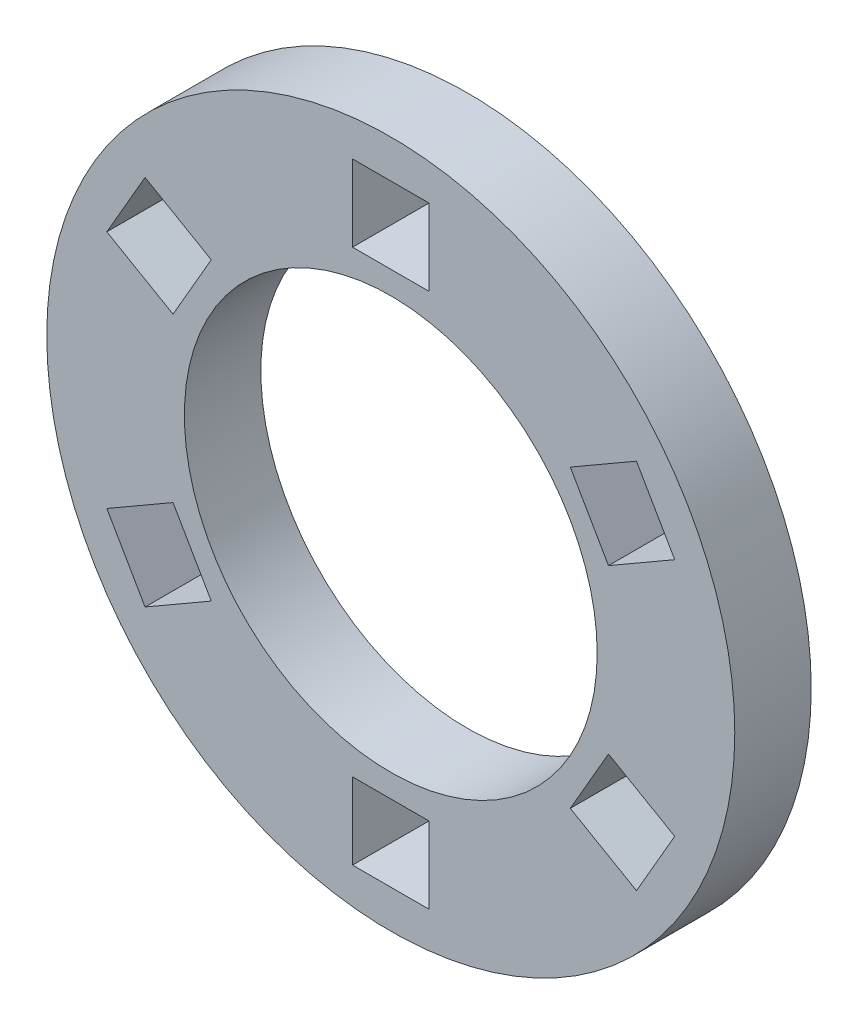
ISO-10303-21;
HEADER;
FILE_DESCRIPTION(('STEP AP214'),'2;1');
FILE_NAME('part.step','',(''),(''),'','','');
FILE_SCHEMA(('AUTOMOTIVE_DESIGN { 1 0 10303 214 1 1 1 1 }'));
ENDSEC;
DATA;
#1=APPLICATION_CONTEXT('core data for automotive mechanical design processes');
#2=APPLICATION_PROTOCOL_DEFINITION('international standard','automotive_design',2000,#1);
#3=PRODUCT_CONTEXT('',#1,'mechanical');
#4=PRODUCT('Part','Part','',(#3));
#5=PRODUCT_RELATED_PRODUCT_CATEGORY('part','',(#4));
#6=PRODUCT_DEFINITION_FORMATION('','',#4);
#7=PRODUCT_DEFINITION_CONTEXT('part definition',#1,'design');
#8=PRODUCT_DEFINITION('design','',#6,#7);
#9=PRODUCT_DEFINITION_SHAPE('','',#8);
#10=(LENGTH_UNIT() NAMED_UNIT(*) SI_UNIT(.MILLI.,.METRE.));
#11=(NAMED_UNIT(*) PLANE_ANGLE_UNIT() SI_UNIT($,.RADIAN.));
#12=(NAMED_UNIT(*) SI_UNIT($,.STERADIAN.) SOLID_ANGLE_UNIT());
#13=UNCERTAINTY_MEASURE_WITH_UNIT(LENGTH_MEASURE(1.E-05),#10,'distance_accuracy_value','');
#14=(GEOMETRIC_REPRESENTATION_CONTEXT(3) GLOBAL_UNCERTAINTY_ASSIGNED_CONTEXT((#13)) GLOBAL_UNIT_ASSIGNED_CONTEXT((#10,
#11,#12)) REPRESENTATION_CONTEXT('',''));
#15=CARTESIAN_POINT('',(0.,0.,0.));
#16=DIRECTION('',(0.,0.,1.));
#17=DIRECTION('',(1.,0.,0.));
#18=AXIS2_PLACEMENT_3D('',#15,#16,#17);
#19=CARTESIAN_POINT('',(0.,0.,5.));
#20=DIRECTION('',(0.,0.,1.));
#21=DIRECTION('',(1.,0.,0.));
#22=AXIS2_PLACEMENT_3D('',#19,#20,#21);
#23=PLANE('',#22);
#24=CARTESIAN_POINT('',(0.,0.,5.));
#25=DIRECTION('',(0.,0.,1.));
#26=DIRECTION('',(1.,0.,0.));
#27=AXIS2_PLACEMENT_3D('',#24,#25,#26);
#28=CIRCLE('',#27,22.5);
#29=CARTESIAN_POINT('',(22.5,0.,5.));
#30=VERTEX_POINT('',#29);
#31=EDGE_CURVE('E11',#30,#30,#28,.T.);
#32=ORIENTED_EDGE('',*,*,#31,.T.);
#33=EDGE_LOOP('',(#32));
#34=FACE_BOUND('',#33,.T.);
#35=CARTESIAN_POINT('',(0.,0.,5.));
#36=DIRECTION('',(0.,0.,1.));
#37=DIRECTION('',(1.,0.,0.));
#38=AXIS2_PLACEMENT_3D('',#35,#36,#37);
#39=CIRCLE('',#38,13.5);
#40=CARTESIAN_POINT('',(13.5,0.,5.));
#41=VERTEX_POINT('',#40);
#42=EDGE_CURVE('E385',#41,#41,#39,.T.);
#43=ORIENTED_EDGE('',*,*,#42,.F.);
#44=EDGE_LOOP('',(#43));
#45=FACE_BOUND('',#44,.T.);
#46=DIRECTION('',(1.,0.,0.));
#47=VECTOR('',#46,1.);
#48=CARTESIAN_POINT('',(-2.5,15.,5.));
#49=LINE('',#48,#47);
#50=CARTESIAN_POINT('',(-2.5,15.,5.));
#51=VERTEX_POINT('',#50);
#52=CARTESIAN_POINT('',(2.5,15.,5.));
#53=VERTEX_POINT('',#52);
#54=EDGE_CURVE('E356',#51,#53,#49,.T.);
#55=ORIENTED_EDGE('',*,*,#54,.F.);
#56=DIRECTION('',(0.,-1.,0.));
#57=VECTOR('',#56,1.);
#58=CARTESIAN_POINT('',(-2.5,20.,5.));
#59=LINE('',#58,#57);
#60=CARTESIAN_POINT('',(-2.5,20.,5.));
#61=VERTEX_POINT('',#60);
#62=EDGE_CURVE('E354',#61,#51,#59,.T.);
#63=ORIENTED_EDGE('',*,*,#62,.F.);
#64=DIRECTION('',(-1.,0.,0.));
#65=VECTOR('',#64,1.);
#66=CARTESIAN_POINT('',(-2.5,20.,5.));
#67=LINE('',#66,#65);
#68=CARTESIAN_POINT('',(2.5,20.,5.));
#69=VERTEX_POINT('',#68);
#70=EDGE_CURVE('E362',#69,#61,#67,.T.);
#71=ORIENTED_EDGE('',*,*,#70,.F.);
#72=DIRECTION('',(0.,1.,0.));
#73=VECTOR('',#72,1.);
#74=CARTESIAN_POINT('',(2.5,20.,5.));
#75=LINE('',#74,#73);
#76=EDGE_CURVE('E359',#53,#69,#75,.T.);
#77=ORIENTED_EDGE('',*,*,#76,.F.);
#78=EDGE_LOOP('',(#55,#63,#71,#77));
#79=FACE_BOUND('',#78,.T.);
#80=DIRECTION('',(-0.866025403784439,-0.5,0.));
#81=VECTOR('',#80,1.);
#82=CARTESIAN_POINT('',(16.0705080756888,12.1650635094611,5.));
#83=LINE('',#82,#81);
#84=CARTESIAN_POINT('',(16.0705080756888,12.1650635094611,5.));
#85=VERTEX_POINT('',#84);
#86=CARTESIAN_POINT('',(11.7403810567666,9.6650635094611,5.));
#87=VERTEX_POINT('',#86);
#88=EDGE_CURVE('E325',#85,#87,#83,.T.);
#89=ORIENTED_EDGE('',*,*,#88,.F.);
#90=DIRECTION('',(-0.5,0.866025403784439,0.));
#91=VECTOR('',#90,1.);
#92=CARTESIAN_POINT('',(16.0705080756888,12.1650635094611,5.));
#93=LINE('',#92,#91);
#94=CARTESIAN_POINT('',(18.5705080756888,7.83493649053891,5.));
#95=VERTEX_POINT('',#94);
#96=EDGE_CURVE('E323',#95,#85,#93,.T.);
#97=ORIENTED_EDGE('',*,*,#96,.F.);
#98=DIRECTION('',(0.866025403784438,0.500000000000001,0.));
#99=VECTOR('',#98,1.);
#100=CARTESIAN_POINT('',(18.5705080756888,7.83493649053891,5.));
#101=LINE('',#100,#99);
#102=CARTESIAN_POINT('',(14.2403810567666,5.3349364905389,5.));
#103=VERTEX_POINT('',#102);
#104=EDGE_CURVE('E331',#103,#95,#101,.T.);
#105=ORIENTED_EDGE('',*,*,#104,.F.);
#106=DIRECTION('',(0.5,-0.866025403784438,0.));
#107=VECTOR('',#106,1.);
#108=CARTESIAN_POINT('',(11.7403810567666,9.6650635094611,5.));
#109=LINE('',#108,#107);
#110=EDGE_CURVE('E328',#87,#103,#109,.T.);
#111=ORIENTED_EDGE('',*,*,#110,.F.);
#112=EDGE_LOOP('',(#89,#97,#105,#111));
#113=FACE_BOUND('',#112,.T.);
#114=DIRECTION('',(-0.866025403784439,0.5,0.));
#115=VECTOR('',#114,1.);
#116=CARTESIAN_POINT('',(18.5705080756888,-7.8349364905389,5.));
#117=LINE('',#116,#115);
#118=CARTESIAN_POINT('',(18.5705080756888,-7.8349364905389,5.));
#119=VERTEX_POINT('',#118);
#120=CARTESIAN_POINT('',(14.2403810567666,-5.3349364905389,5.));
#121=VERTEX_POINT('',#120);
#122=EDGE_CURVE('E294',#119,#121,#117,.T.);
#123=ORIENTED_EDGE('',*,*,#122,.F.);
#124=DIRECTION('',(0.5,0.866025403784439,0.));
#125=VECTOR('',#124,1.);
#126=CARTESIAN_POINT('',(18.5705080756888,-7.8349364905389,5.));
#127=LINE('',#126,#125);
#128=CARTESIAN_POINT('',(16.0705080756888,-12.1650635094611,5.));
#129=VERTEX_POINT('',#128);
#130=EDGE_CURVE('E292',#129,#119,#127,.T.);
#131=ORIENTED_EDGE('',*,*,#130,.F.);
#132=DIRECTION('',(0.866025403784439,-0.499999999999999,0.));
#133=VECTOR('',#132,1.);
#134=CARTESIAN_POINT('',(16.0705080756888,-12.1650635094611,5.));
#135=LINE('',#134,#133);
#136=CARTESIAN_POINT('',(11.7403810567666,-9.6650635094611,5.));
#137=VERTEX_POINT('',#136);
#138=EDGE_CURVE('E300',#137,#129,#135,.T.);
#139=ORIENTED_EDGE('',*,*,#138,.F.);
#140=DIRECTION('',(-0.499999999999999,-0.866025403784439,0.));
#141=VECTOR('',#140,1.);
#142=CARTESIAN_POINT('',(14.2403810567666,-5.3349364905389,5.));
#143=LINE('',#142,#141);
#144=EDGE_CURVE('E297',#121,#137,#143,.T.);
#145=ORIENTED_EDGE('',*,*,#144,.F.);
#146=EDGE_LOOP('',(#123,#131,#139,#145));
#147=FACE_BOUND('',#146,.T.);
#148=DIRECTION('',(0.,1.,0.));
#149=VECTOR('',#148,1.);
#150=CARTESIAN_POINT('',(2.5,-20.,5.));
#151=LINE('',#150,#149);
#152=CARTESIAN_POINT('',(2.5,-20.,5.));
#153=VERTEX_POINT('',#152);
#154=CARTESIAN_POINT('',(2.5,-15.,5.));
#155=VERTEX_POINT('',#154);
#156=EDGE_CURVE('E263',#153,#155,#151,.T.);
#157=ORIENTED_EDGE('',*,*,#156,.F.);
#158=DIRECTION('',(1.,0.,0.));
#159=VECTOR('',#158,1.);
#160=CARTESIAN_POINT('',(2.5,-20.,5.));
#161=LINE('',#160,#159);
#162=CARTESIAN_POINT('',(-2.5,-20.,5.));
#163=VERTEX_POINT('',#162);
#164=EDGE_CURVE('E261',#163,#153,#161,.T.);
#165=ORIENTED_EDGE('',*,*,#164,.F.);
#166=DIRECTION('',(0.,-1.,0.));
#167=VECTOR('',#166,1.);
#168=CARTESIAN_POINT('',(-2.5,-20.,5.));
#169=LINE('',#168,#167);
#170=CARTESIAN_POINT('',(-2.5,-15.,5.));
#171=VERTEX_POINT('',#170);
#172=EDGE_CURVE('E269',#171,#163,#169,.T.);
#173=ORIENTED_EDGE('',*,*,#172,.F.);
#174=DIRECTION('',(-1.,0.,0.));
#175=VECTOR('',#174,1.);
#176=CARTESIAN_POINT('',(2.5,-15.,5.));
#177=LINE('',#176,#175);
#178=EDGE_CURVE('E266',#155,#171,#177,.T.);
#179=ORIENTED_EDGE('',*,*,#178,.F.);
#180=EDGE_LOOP('',(#157,#165,#173,#179));
#181=FACE_BOUND('',#180,.T.);
#182=DIRECTION('',(0.866025403784439,0.5,0.));
#183=VECTOR('',#182,1.);
#184=CARTESIAN_POINT('',(-16.0705080756888,-12.1650635094611,5.));
#185=LINE('',#184,#183);
#186=CARTESIAN_POINT('',(-16.0705080756888,-12.1650635094611,5.));
#187=VERTEX_POINT('',#186);
#188=CARTESIAN_POINT('',(-11.7403810567666,-9.6650635094611,5.));
#189=VERTEX_POINT('',#188);
#190=EDGE_CURVE('E232',#187,#189,#185,.T.);
#191=ORIENTED_EDGE('',*,*,#190,.F.);
#192=DIRECTION('',(0.5,-0.866025403784438,0.));
#193=VECTOR('',#192,1.);
#194=CARTESIAN_POINT('',(-16.0705080756888,-12.1650635094611,5.));
#195=LINE('',#194,#193);
#196=CARTESIAN_POINT('',(-18.5705080756888,-7.83493649053891,5.));
#197=VERTEX_POINT('',#196);
#198=EDGE_CURVE('E230',#197,#187,#195,.T.);
#199=ORIENTED_EDGE('',*,*,#198,.F.);
#200=DIRECTION('',(-0.866025403784438,-0.500000000000001,0.));
#201=VECTOR('',#200,1.);
#202=CARTESIAN_POINT('',(-18.5705080756888,-7.83493649053891,5.));
#203=LINE('',#202,#201);
#204=CARTESIAN_POINT('',(-14.2403810567666,-5.33493649053891,5.));
#205=VERTEX_POINT('',#204);
#206=EDGE_CURVE('E238',#205,#197,#203,.T.);
#207=ORIENTED_EDGE('',*,*,#206,.F.);
#208=DIRECTION('',(-0.5,0.866025403784438,0.));
#209=VECTOR('',#208,1.);
#210=CARTESIAN_POINT('',(-11.7403810567666,-9.6650635094611,5.));
#211=LINE('',#210,#209);
#212=EDGE_CURVE('E235',#189,#205,#211,.T.);
#213=ORIENTED_EDGE('',*,*,#212,.F.);
#214=EDGE_LOOP('',(#191,#199,#207,#213));
#215=FACE_BOUND('',#214,.T.);
#216=DIRECTION('',(0.866025403784439,-0.5,0.));
#217=VECTOR('',#216,1.);
#218=CARTESIAN_POINT('',(-18.5705080756888,7.83493649053889,5.));
#219=LINE('',#218,#217);
#220=CARTESIAN_POINT('',(-18.5705080756888,7.83493649053889,5.));
#221=VERTEX_POINT('',#220);
#222=CARTESIAN_POINT('',(-14.2403810567666,5.33493649053889,5.));
#223=VERTEX_POINT('',#222);
#224=EDGE_CURVE('E202',#221,#223,#219,.T.);
#225=ORIENTED_EDGE('',*,*,#224,.F.);
#226=DIRECTION('',(-0.5,-0.866025403784439,0.));
#227=VECTOR('',#226,1.);
#228=CARTESIAN_POINT('',(-18.5705080756888,7.83493649053889,5.));
#229=LINE('',#228,#227);
#230=CARTESIAN_POINT('',(-16.0705080756888,12.1650635094611,5.));
#231=VERTEX_POINT('',#230);
#232=EDGE_CURVE('E194',#231,#221,#229,.T.);
#233=ORIENTED_EDGE('',*,*,#232,.F.);
#234=DIRECTION('',(-0.866025403784439,0.499999999999999,0.));
#235=VECTOR('',#234,1.);
#236=CARTESIAN_POINT('',(-16.0705080756888,12.1650635094611,5.));
#237=LINE('',#236,#235);
#238=CARTESIAN_POINT('',(-11.7403810567666,9.66506350946109,5.));
#239=VERTEX_POINT('',#238);
#240=EDGE_CURVE('E216',#239,#231,#237,.T.);
#241=ORIENTED_EDGE('',*,*,#240,.F.);
#242=DIRECTION('',(0.499999999999999,0.866025403784439,0.));
#243=VECTOR('',#242,1.);
#244=CARTESIAN_POINT('',(-14.2403810567666,5.33493649053889,5.));
#245=LINE('',#244,#243);
#246=EDGE_CURVE('E214',#223,#239,#245,.T.);
#247=ORIENTED_EDGE('',*,*,#246,.F.);
#248=EDGE_LOOP('',(#225,#233,#241,#247));
#249=FACE_BOUND('',#248,.T.);
#250=ADVANCED_FACE('F33',(#34,#45,#79,#113,#147,#181,#215,#249),#23,.T.);
#251=CARTESIAN_POINT('',(0.,0.,0.));
#252=DIRECTION('',(0.,0.,1.));
#253=DIRECTION('',(1.,0.,0.));
#254=AXIS2_PLACEMENT_3D('',#251,#252,#253);
#255=PLANE('',#254);
#256=DIRECTION('',(0.5,-0.866025403784438,0.));
#257=VECTOR('',#256,1.);
#258=CARTESIAN_POINT('',(-16.0705080756888,-12.1650635094611,0.));
#259=LINE('',#258,#257);
#260=CARTESIAN_POINT('',(-18.5705080756888,-7.83493649053891,0.));
#261=VERTEX_POINT('',#260);
#262=CARTESIAN_POINT('',(-16.0705080756888,-12.1650635094611,0.));
#263=VERTEX_POINT('',#262);
#264=EDGE_CURVE('E210',#261,#263,#259,.T.);
#265=ORIENTED_EDGE('',*,*,#264,.T.);
#266=DIRECTION('',(0.866025403784439,0.5,0.));
#267=VECTOR('',#266,1.);
#268=CARTESIAN_POINT('',(-16.0705080756888,-12.1650635094611,0.));
#269=LINE('',#268,#267);
#270=CARTESIAN_POINT('',(-11.7403810567666,-9.6650635094611,0.));
#271=VERTEX_POINT('',#270);
#272=EDGE_CURVE('E243',#263,#271,#269,.T.);
#273=ORIENTED_EDGE('',*,*,#272,.T.);
#274=DIRECTION('',(-0.5,0.866025403784438,0.));
#275=VECTOR('',#274,1.);
#276=CARTESIAN_POINT('',(-11.7403810567666,-9.6650635094611,0.));
#277=LINE('',#276,#275);
#278=CARTESIAN_POINT('',(-14.2403810567666,-5.33493649053891,0.));
#279=VERTEX_POINT('',#278);
#280=EDGE_CURVE('E246',#271,#279,#277,.T.);
#281=ORIENTED_EDGE('',*,*,#280,.T.);
#282=DIRECTION('',(-0.866025403784438,-0.500000000000001,0.));
#283=VECTOR('',#282,1.);
#284=CARTESIAN_POINT('',(-18.5705080756888,-7.83493649053891,0.));
#285=LINE('',#284,#283);
#286=EDGE_CURVE('E233',#279,#261,#285,.T.);
#287=ORIENTED_EDGE('',*,*,#286,.T.);
#288=EDGE_LOOP('',(#265,#273,#281,#287));
#289=FACE_BOUND('',#288,.T.);
#290=DIRECTION('',(0.5,0.866025403784439,0.));
#291=VECTOR('',#290,1.);
#292=CARTESIAN_POINT('',(18.5705080756888,-7.8349364905389,0.));
#293=LINE('',#292,#291);
#294=CARTESIAN_POINT('',(16.0705080756888,-12.1650635094611,0.));
#295=VERTEX_POINT('',#294);
#296=CARTESIAN_POINT('',(18.5705080756888,-7.8349364905389,0.));
#297=VERTEX_POINT('',#296);
#298=EDGE_CURVE('E291',#295,#297,#293,.T.);
#299=ORIENTED_EDGE('',*,*,#298,.T.);
#300=DIRECTION('',(-0.866025403784439,0.5,0.));
#301=VECTOR('',#300,1.);
#302=CARTESIAN_POINT('',(18.5705080756888,-7.8349364905389,0.));
#303=LINE('',#302,#301);
#304=CARTESIAN_POINT('',(14.2403810567666,-5.3349364905389,0.));
#305=VERTEX_POINT('',#304);
#306=EDGE_CURVE('E305',#297,#305,#303,.T.);
#307=ORIENTED_EDGE('',*,*,#306,.T.);
#308=DIRECTION('',(-0.499999999999999,-0.866025403784439,0.));
#309=VECTOR('',#308,1.);
#310=CARTESIAN_POINT('',(14.2403810567666,-5.3349364905389,0.));
#311=LINE('',#310,#309);
#312=CARTESIAN_POINT('',(11.7403810567666,-9.6650635094611,0.));
#313=VERTEX_POINT('',#312);
#314=EDGE_CURVE('E308',#305,#313,#311,.T.);
#315=ORIENTED_EDGE('',*,*,#314,.T.);
#316=DIRECTION('',(0.866025403784439,-0.499999999999999,0.));
#317=VECTOR('',#316,1.);
#318=CARTESIAN_POINT('',(16.0705080756888,-12.1650635094611,0.));
#319=LINE('',#318,#317);
#320=EDGE_CURVE('E295',#313,#295,#319,.T.);
#321=ORIENTED_EDGE('',*,*,#320,.T.);
#322=EDGE_LOOP('',(#299,#307,#315,#321));
#323=FACE_BOUND('',#322,.T.);
#324=DIRECTION('',(0.,-1.,0.));
#325=VECTOR('',#324,1.);
#326=CARTESIAN_POINT('',(-2.5,20.,0.));
#327=LINE('',#326,#325);
#328=CARTESIAN_POINT('',(-2.5,20.,0.));
#329=VERTEX_POINT('',#328);
#330=CARTESIAN_POINT('',(-2.5,15.,0.));
#331=VERTEX_POINT('',#330);
#332=EDGE_CURVE('E353',#329,#331,#327,.T.);
#333=ORIENTED_EDGE('',*,*,#332,.T.);
#334=DIRECTION('',(1.,0.,0.));
#335=VECTOR('',#334,1.);
#336=CARTESIAN_POINT('',(-2.5,15.,0.));
#337=LINE('',#336,#335);
#338=CARTESIAN_POINT('',(2.5,15.,0.));
#339=VERTEX_POINT('',#338);
#340=EDGE_CURVE('E367',#331,#339,#337,.T.);
#341=ORIENTED_EDGE('',*,*,#340,.T.);
#342=DIRECTION('',(0.,1.,0.));
#343=VECTOR('',#342,1.);
#344=CARTESIAN_POINT('',(2.5,20.,0.));
#345=LINE('',#344,#343);
#346=CARTESIAN_POINT('',(2.5,20.,0.));
#347=VERTEX_POINT('',#346);
#348=EDGE_CURVE('E370',#339,#347,#345,.T.);
#349=ORIENTED_EDGE('',*,*,#348,.T.);
#350=DIRECTION('',(-1.,0.,0.));
#351=VECTOR('',#350,1.);
#352=CARTESIAN_POINT('',(-2.5,20.,0.));
#353=LINE('',#352,#351);
#354=EDGE_CURVE('E357',#347,#329,#353,.T.);
#355=ORIENTED_EDGE('',*,*,#354,.T.);
#356=EDGE_LOOP('',(#333,#341,#349,#355));
#357=FACE_BOUND('',#356,.T.);
#358=CARTESIAN_POINT('',(0.,0.,0.));
#359=DIRECTION('',(0.,0.,1.));
#360=DIRECTION('',(1.,0.,0.));
#361=AXIS2_PLACEMENT_3D('',#358,#359,#360);
#362=CIRCLE('',#361,22.5);
#363=CARTESIAN_POINT('',(22.5,0.,0.));
#364=VERTEX_POINT('',#363);
#365=EDGE_CURVE('E37',#364,#364,#362,.T.);
#366=ORIENTED_EDGE('',*,*,#365,.F.);
#367=EDGE_LOOP('',(#366));
#368=FACE_BOUND('',#367,.T.);
#369=CARTESIAN_POINT('',(0.,0.,0.));
#370=DIRECTION('',(0.,0.,1.));
#371=DIRECTION('',(1.,0.,0.));
#372=AXIS2_PLACEMENT_3D('',#369,#370,#371);
#373=CIRCLE('',#372,13.5);
#374=CARTESIAN_POINT('',(13.5,0.,0.));
#375=VERTEX_POINT('',#374);
#376=EDGE_CURVE('E384',#375,#375,#373,.T.);
#377=ORIENTED_EDGE('',*,*,#376,.T.);
#378=EDGE_LOOP('',(#377));
#379=FACE_BOUND('',#378,.T.);
#380=DIRECTION('',(-0.5,0.866025403784439,0.));
#381=VECTOR('',#380,1.);
#382=CARTESIAN_POINT('',(16.0705080756888,12.1650635094611,0.));
#383=LINE('',#382,#381);
#384=CARTESIAN_POINT('',(18.5705080756888,7.83493649053891,0.));
#385=VERTEX_POINT('',#384);
#386=CARTESIAN_POINT('',(16.0705080756888,12.1650635094611,0.));
#387=VERTEX_POINT('',#386);
#388=EDGE_CURVE('E322',#385,#387,#383,.T.);
#389=ORIENTED_EDGE('',*,*,#388,.T.);
#390=DIRECTION('',(-0.866025403784439,-0.5,0.));
#391=VECTOR('',#390,1.);
#392=CARTESIAN_POINT('',(16.0705080756888,12.1650635094611,0.));
#393=LINE('',#392,#391);
#394=CARTESIAN_POINT('',(11.7403810567666,9.6650635094611,0.));
#395=VERTEX_POINT('',#394);
#396=EDGE_CURVE('E336',#387,#395,#393,.T.);
#397=ORIENTED_EDGE('',*,*,#396,.T.);
#398=DIRECTION('',(0.5,-0.866025403784438,0.));
#399=VECTOR('',#398,1.);
#400=CARTESIAN_POINT('',(11.7403810567666,9.6650635094611,0.));
#401=LINE('',#400,#399);
#402=CARTESIAN_POINT('',(14.2403810567666,5.3349364905389,0.));
#403=VERTEX_POINT('',#402);
#404=EDGE_CURVE('E339',#395,#403,#401,.T.);
#405=ORIENTED_EDGE('',*,*,#404,.T.);
#406=DIRECTION('',(0.866025403784438,0.500000000000001,0.));
#407=VECTOR('',#406,1.);
#408=CARTESIAN_POINT('',(18.5705080756888,7.83493649053891,0.));
#409=LINE('',#408,#407);
#410=EDGE_CURVE('E326',#403,#385,#409,.T.);
#411=ORIENTED_EDGE('',*,*,#410,.T.);
#412=EDGE_LOOP('',(#389,#397,#405,#411));
#413=FACE_BOUND('',#412,.T.);
#414=DIRECTION('',(1.,0.,0.));
#415=VECTOR('',#414,1.);
#416=CARTESIAN_POINT('',(2.5,-20.,0.));
#417=LINE('',#416,#415);
#418=CARTESIAN_POINT('',(-2.5,-20.,0.));
#419=VERTEX_POINT('',#418);
#420=CARTESIAN_POINT('',(2.5,-20.,0.));
#421=VERTEX_POINT('',#420);
#422=EDGE_CURVE('E260',#419,#421,#417,.T.);
#423=ORIENTED_EDGE('',*,*,#422,.T.);
#424=DIRECTION('',(0.,1.,0.));
#425=VECTOR('',#424,1.);
#426=CARTESIAN_POINT('',(2.5,-20.,0.));
#427=LINE('',#426,#425);
#428=CARTESIAN_POINT('',(2.5,-15.,0.));
#429=VERTEX_POINT('',#428);
#430=EDGE_CURVE('E274',#421,#429,#427,.T.);
#431=ORIENTED_EDGE('',*,*,#430,.T.);
#432=DIRECTION('',(-1.,0.,0.));
#433=VECTOR('',#432,1.);
#434=CARTESIAN_POINT('',(2.5,-15.,0.));
#435=LINE('',#434,#433);
#436=CARTESIAN_POINT('',(-2.5,-15.,0.));
#437=VERTEX_POINT('',#436);
#438=EDGE_CURVE('E277',#429,#437,#435,.T.);
#439=ORIENTED_EDGE('',*,*,#438,.T.);
#440=DIRECTION('',(0.,-1.,0.));
#441=VECTOR('',#440,1.);
#442=CARTESIAN_POINT('',(-2.5,-20.,0.));
#443=LINE('',#442,#441);
#444=EDGE_CURVE('E264',#437,#419,#443,.T.);
#445=ORIENTED_EDGE('',*,*,#444,.T.);
#446=EDGE_LOOP('',(#423,#431,#439,#445));
#447=FACE_BOUND('',#446,.T.);
#448=DIRECTION('',(-0.5,-0.866025403784439,0.));
#449=VECTOR('',#448,1.);
#450=CARTESIAN_POINT('',(-18.5705080756888,7.83493649053889,0.));
#451=LINE('',#450,#449);
#452=CARTESIAN_POINT('',(-16.0705080756888,12.1650635094611,0.));
#453=VERTEX_POINT('',#452);
#454=CARTESIAN_POINT('',(-18.5705080756888,7.83493649053889,0.));
#455=VERTEX_POINT('',#454);
#456=EDGE_CURVE('E56',#453,#455,#451,.T.);
#457=ORIENTED_EDGE('',*,*,#456,.T.);
#458=DIRECTION('',(0.866025403784439,-0.5,0.));
#459=VECTOR('',#458,1.);
#460=CARTESIAN_POINT('',(-18.5705080756888,7.83493649053889,0.));
#461=LINE('',#460,#459);
#462=CARTESIAN_POINT('',(-14.2403810567666,5.33493649053889,0.));
#463=VERTEX_POINT('',#462);
#464=EDGE_CURVE('E209',#455,#463,#461,.T.);
#465=ORIENTED_EDGE('',*,*,#464,.T.);
#466=DIRECTION('',(0.499999999999999,0.866025403784439,0.));
#467=VECTOR('',#466,1.);
#468=CARTESIAN_POINT('',(-14.2403810567666,5.33493649053889,0.));
#469=LINE('',#468,#467);
#470=CARTESIAN_POINT('',(-11.7403810567666,9.66506350946109,0.));
#471=VERTEX_POINT('',#470);
#472=EDGE_CURVE('E222',#463,#471,#469,.T.);
#473=ORIENTED_EDGE('',*,*,#472,.T.);
#474=DIRECTION('',(-0.866025403784439,0.499999999999999,0.));
#475=VECTOR('',#474,1.);
#476=CARTESIAN_POINT('',(-16.0705080756888,12.1650635094611,0.));
#477=LINE('',#476,#475);
#478=EDGE_CURVE('E203',#471,#453,#477,.T.);
#479=ORIENTED_EDGE('',*,*,#478,.T.);
#480=EDGE_LOOP('',(#457,#465,#473,#479));
#481=FACE_BOUND('',#480,.T.);
#482=ADVANCED_FACE('F391',(#289,#323,#357,#368,#379,#413,#447,#481),#255,.F.);
#483=CARTESIAN_POINT('',(0.,0.,5.));
#484=DIRECTION('',(0.,0.,-1.));
#485=DIRECTION('',(-1.,0.,0.));
#486=AXIS2_PLACEMENT_3D('',#483,#484,#485);
#487=CYLINDRICAL_SURFACE('',#486,22.5);
#488=ORIENTED_EDGE('',*,*,#31,.F.);
#489=EDGE_LOOP('',(#488));
#490=FACE_BOUND('',#489,.T.);
#491=ORIENTED_EDGE('',*,*,#365,.T.);
#492=EDGE_LOOP('',(#491));
#493=FACE_BOUND('',#492,.T.);
#494=ADVANCED_FACE('F35',(#490,#493),#487,.T.);
#495=CARTESIAN_POINT('',(0.,0.,5.));
#496=DIRECTION('',(0.,0.,-1.));
#497=DIRECTION('',(-1.,0.,0.));
#498=AXIS2_PLACEMENT_3D('',#495,#496,#497);
#499=CYLINDRICAL_SURFACE('',#498,13.5);
#500=ORIENTED_EDGE('',*,*,#42,.T.);
#501=EDGE_LOOP('',(#500));
#502=FACE_BOUND('',#501,.T.);
#503=ORIENTED_EDGE('',*,*,#376,.F.);
#504=EDGE_LOOP('',(#503));
#505=FACE_BOUND('',#504,.T.);
#506=ADVANCED_FACE('F394',(#502,#505),#499,.F.);
#507=CARTESIAN_POINT('',(-2.5,20.,5.));
#508=DIRECTION('',(1.,0.,0.));
#509=DIRECTION('',(0.,1.,0.));
#510=AXIS2_PLACEMENT_3D('',#507,#508,#509);
#511=PLANE('',#510);
#512=ORIENTED_EDGE('',*,*,#332,.F.);
#513=DIRECTION('',(0.,0.,-1.));
#514=VECTOR('',#513,1.);
#515=CARTESIAN_POINT('',(-2.5,20.,5.));
#516=LINE('',#515,#514);
#517=EDGE_CURVE('E364',#61,#329,#516,.T.);
#518=ORIENTED_EDGE('',*,*,#517,.F.);
#519=ORIENTED_EDGE('',*,*,#62,.T.);
#520=DIRECTION('',(0.,0.,-1.));
#521=VECTOR('',#520,1.);
#522=CARTESIAN_POINT('',(-2.5,15.,5.));
#523=LINE('',#522,#521);
#524=EDGE_CURVE('E381',#51,#331,#523,.T.);
#525=ORIENTED_EDGE('',*,*,#524,.T.);
#526=EDGE_LOOP('',(#512,#518,#519,#525));
#527=FACE_BOUND('',#526,.T.);
#528=ADVANCED_FACE('F396',(#527),#511,.T.);
#529=CARTESIAN_POINT('',(-2.5,15.,5.));
#530=DIRECTION('',(0.,1.,0.));
#531=DIRECTION('',(0.,0.,1.));
#532=AXIS2_PLACEMENT_3D('',#529,#530,#531);
#533=PLANE('',#532);
#534=ORIENTED_EDGE('',*,*,#340,.F.);
#535=ORIENTED_EDGE('',*,*,#524,.F.);
#536=ORIENTED_EDGE('',*,*,#54,.T.);
#537=DIRECTION('',(0.,0.,-1.));
#538=VECTOR('',#537,1.);
#539=CARTESIAN_POINT('',(2.5,15.,5.));
#540=LINE('',#539,#538);
#541=EDGE_CURVE('E379',#53,#339,#540,.T.);
#542=ORIENTED_EDGE('',*,*,#541,.T.);
#543=EDGE_LOOP('',(#534,#535,#536,#542));
#544=FACE_BOUND('',#543,.T.);
#545=ADVANCED_FACE('F403',(#544),#533,.T.);
#546=CARTESIAN_POINT('',(2.5,20.,5.));
#547=DIRECTION('',(-1.,0.,0.));
#548=DIRECTION('',(0.,-1.,0.));
#549=AXIS2_PLACEMENT_3D('',#546,#547,#548);
#550=PLANE('',#549);
#551=ORIENTED_EDGE('',*,*,#348,.F.);
#552=ORIENTED_EDGE('',*,*,#541,.F.);
#553=ORIENTED_EDGE('',*,*,#76,.T.);
#554=DIRECTION('',(0.,0.,-1.));
#555=VECTOR('',#554,1.);
#556=CARTESIAN_POINT('',(2.5,20.,5.));
#557=LINE('',#556,#555);
#558=EDGE_CURVE('E377',#69,#347,#557,.T.);
#559=ORIENTED_EDGE('',*,*,#558,.T.);
#560=EDGE_LOOP('',(#551,#552,#553,#559));
#561=FACE_BOUND('',#560,.T.);
#562=ADVANCED_FACE('F517',(#561),#550,.T.);
#563=CARTESIAN_POINT('',(-2.5,20.,5.));
#564=DIRECTION('',(0.,-1.,0.));
#565=DIRECTION('',(0.,0.,-1.));
#566=AXIS2_PLACEMENT_3D('',#563,#564,#565);
#567=PLANE('',#566);
#568=ORIENTED_EDGE('',*,*,#354,.F.);
#569=ORIENTED_EDGE('',*,*,#558,.F.);
#570=ORIENTED_EDGE('',*,*,#70,.T.);
#571=ORIENTED_EDGE('',*,*,#517,.T.);
#572=EDGE_LOOP('',(#568,#569,#570,#571));
#573=FACE_BOUND('',#572,.T.);
#574=ADVANCED_FACE('F513',(#573),#567,.T.);
#575=CARTESIAN_POINT('',(16.0705080756888,12.1650635094611,5.));
#576=DIRECTION('',(-0.866025403784439,-0.5,0.));
#577=DIRECTION('',(0.5,-0.866025403784439,0.));
#578=AXIS2_PLACEMENT_3D('',#575,#576,#577);
#579=PLANE('',#578);
#580=ORIENTED_EDGE('',*,*,#388,.F.);
#581=DIRECTION('',(0.,0.,-1.));
#582=VECTOR('',#581,1.);
#583=CARTESIAN_POINT('',(18.5705080756888,7.83493649053891,5.));
#584=LINE('',#583,#582);
#585=EDGE_CURVE('E333',#95,#385,#584,.T.);
#586=ORIENTED_EDGE('',*,*,#585,.F.);
#587=ORIENTED_EDGE('',*,*,#96,.T.);
#588=DIRECTION('',(0.,0.,-1.));
#589=VECTOR('',#588,1.);
#590=CARTESIAN_POINT('',(16.0705080756888,12.1650635094611,5.));
#591=LINE('',#590,#589);
#592=EDGE_CURVE('E350',#85,#387,#591,.T.);
#593=ORIENTED_EDGE('',*,*,#592,.T.);
#594=EDGE_LOOP('',(#580,#586,#587,#593));
#595=FACE_BOUND('',#594,.T.);
#596=ADVANCED_FACE('F509',(#595),#579,.T.);
#597=CARTESIAN_POINT('',(16.0705080756888,12.1650635094611,5.));
#598=DIRECTION('',(0.5,-0.866025403784439,0.));
#599=DIRECTION('',(0.866025403784439,0.5,0.));
#600=AXIS2_PLACEMENT_3D('',#597,#598,#599);
#601=PLANE('',#600);
#602=ORIENTED_EDGE('',*,*,#396,.F.);
#603=ORIENTED_EDGE('',*,*,#592,.F.);
#604=ORIENTED_EDGE('',*,*,#88,.T.);
#605=DIRECTION('',(0.,0.,-1.));
#606=VECTOR('',#605,1.);
#607=CARTESIAN_POINT('',(11.7403810567666,9.6650635094611,5.));
#608=LINE('',#607,#606);
#609=EDGE_CURVE('E348',#87,#395,#608,.T.);
#610=ORIENTED_EDGE('',*,*,#609,.T.);
#611=EDGE_LOOP('',(#602,#603,#604,#610));
#612=FACE_BOUND('',#611,.T.);
#613=ADVANCED_FACE('F505',(#612),#601,.T.);
#614=CARTESIAN_POINT('',(11.7403810567666,9.6650635094611,5.));
#615=DIRECTION('',(0.866025403784439,0.5,0.));
#616=DIRECTION('',(-0.5,0.866025403784439,0.));
#617=AXIS2_PLACEMENT_3D('',#614,#615,#616);
#618=PLANE('',#617);
#619=ORIENTED_EDGE('',*,*,#404,.F.);
#620=ORIENTED_EDGE('',*,*,#609,.F.);
#621=ORIENTED_EDGE('',*,*,#110,.T.);
#622=DIRECTION('',(0.,0.,-1.));
#623=VECTOR('',#622,1.);
#624=CARTESIAN_POINT('',(14.2403810567666,5.3349364905389,5.));
#625=LINE('',#624,#623);
#626=EDGE_CURVE('E346',#103,#403,#625,.T.);
#627=ORIENTED_EDGE('',*,*,#626,.T.);
#628=EDGE_LOOP('',(#619,#620,#621,#627));
#629=FACE_BOUND('',#628,.T.);
#630=ADVANCED_FACE('F501',(#629),#618,.T.);
#631=CARTESIAN_POINT('',(18.5705080756888,7.83493649053891,5.));
#632=DIRECTION('',(-0.500000000000001,0.866025403784438,0.));
#633=DIRECTION('',(-0.866025403784438,-0.500000000000001,0.));
#634=AXIS2_PLACEMENT_3D('',#631,#632,#633);
#635=PLANE('',#634);
#636=ORIENTED_EDGE('',*,*,#410,.F.);
#637=ORIENTED_EDGE('',*,*,#626,.F.);
#638=ORIENTED_EDGE('',*,*,#104,.T.);
#639=ORIENTED_EDGE('',*,*,#585,.T.);
#640=EDGE_LOOP('',(#636,#637,#638,#639));
#641=FACE_BOUND('',#640,.T.);
#642=ADVANCED_FACE('F497',(#641),#635,.T.);
#643=CARTESIAN_POINT('',(18.5705080756888,-7.8349364905389,5.));
#644=DIRECTION('',(-0.866025403784439,0.5,0.));
#645=DIRECTION('',(-0.5,-0.866025403784439,0.));
#646=AXIS2_PLACEMENT_3D('',#643,#644,#645);
#647=PLANE('',#646);
#648=ORIENTED_EDGE('',*,*,#298,.F.);
#649=DIRECTION('',(0.,0.,-1.));
#650=VECTOR('',#649,1.);
#651=CARTESIAN_POINT('',(16.0705080756888,-12.1650635094611,5.));
#652=LINE('',#651,#650);
#653=EDGE_CURVE('E302',#129,#295,#652,.T.);
#654=ORIENTED_EDGE('',*,*,#653,.F.);
#655=ORIENTED_EDGE('',*,*,#130,.T.);
#656=DIRECTION('',(0.,0.,-1.));
#657=VECTOR('',#656,1.);
#658=CARTESIAN_POINT('',(18.5705080756888,-7.8349364905389,5.));
#659=LINE('',#658,#657);
#660=EDGE_CURVE('E319',#119,#297,#659,.T.);
#661=ORIENTED_EDGE('',*,*,#660,.T.);
#662=EDGE_LOOP('',(#648,#654,#655,#661));
#663=FACE_BOUND('',#662,.T.);
#664=ADVANCED_FACE('F493',(#663),#647,.T.);
#665=CARTESIAN_POINT('',(18.5705080756888,-7.8349364905389,5.));
#666=DIRECTION('',(-0.5,-0.866025403784438,0.));
#667=DIRECTION('',(0.866025403784439,-0.5,0.));
#668=AXIS2_PLACEMENT_3D('',#665,#666,#667);
#669=PLANE('',#668);
#670=ORIENTED_EDGE('',*,*,#306,.F.);
#671=ORIENTED_EDGE('',*,*,#660,.F.);
#672=ORIENTED_EDGE('',*,*,#122,.T.);
#673=DIRECTION('',(0.,0.,-1.));
#674=VECTOR('',#673,1.);
#675=CARTESIAN_POINT('',(14.2403810567666,-5.3349364905389,5.));
#676=LINE('',#675,#674);
#677=EDGE_CURVE('E317',#121,#305,#676,.T.);
#678=ORIENTED_EDGE('',*,*,#677,.T.);
#679=EDGE_LOOP('',(#670,#671,#672,#678));
#680=FACE_BOUND('',#679,.T.);
#681=ADVANCED_FACE('F489',(#680),#669,.T.);
#682=CARTESIAN_POINT('',(14.2403810567666,-5.3349364905389,5.));
#683=DIRECTION('',(0.866025403784439,-0.5,0.));
#684=DIRECTION('',(0.5,0.866025403784439,0.));
#685=AXIS2_PLACEMENT_3D('',#682,#683,#684);
#686=PLANE('',#685);
#687=ORIENTED_EDGE('',*,*,#314,.F.);
#688=ORIENTED_EDGE('',*,*,#677,.F.);
#689=ORIENTED_EDGE('',*,*,#144,.T.);
#690=DIRECTION('',(0.,0.,-1.));
#691=VECTOR('',#690,1.);
#692=CARTESIAN_POINT('',(11.7403810567666,-9.6650635094611,5.));
#693=LINE('',#692,#691);
#694=EDGE_CURVE('E315',#137,#313,#693,.T.);
#695=ORIENTED_EDGE('',*,*,#694,.T.);
#696=EDGE_LOOP('',(#687,#688,#689,#695));
#697=FACE_BOUND('',#696,.T.);
#698=ADVANCED_FACE('F485',(#697),#686,.T.);
#699=CARTESIAN_POINT('',(16.0705080756888,-12.1650635094611,5.));
#700=DIRECTION('',(0.499999999999999,0.866025403784439,0.));
#701=DIRECTION('',(-0.866025403784439,0.499999999999999,0.));
#702=AXIS2_PLACEMENT_3D('',#699,#700,#701);
#703=PLANE('',#702);
#704=ORIENTED_EDGE('',*,*,#320,.F.);
#705=ORIENTED_EDGE('',*,*,#694,.F.);
#706=ORIENTED_EDGE('',*,*,#138,.T.);
#707=ORIENTED_EDGE('',*,*,#653,.T.);
#708=EDGE_LOOP('',(#704,#705,#706,#707));
#709=FACE_BOUND('',#708,.T.);
#710=ADVANCED_FACE('F481',(#709),#703,.T.);
#711=CARTESIAN_POINT('',(2.5,-20.,5.));
#712=DIRECTION('',(0.,1.,0.));
#713=DIRECTION('',(0.,0.,1.));
#714=AXIS2_PLACEMENT_3D('',#711,#712,#713);
#715=PLANE('',#714);
#716=ORIENTED_EDGE('',*,*,#422,.F.);
#717=DIRECTION('',(0.,0.,-1.));
#718=VECTOR('',#717,1.);
#719=CARTESIAN_POINT('',(-2.5,-20.,5.));
#720=LINE('',#719,#718);
#721=EDGE_CURVE('E271',#163,#419,#720,.T.);
#722=ORIENTED_EDGE('',*,*,#721,.F.);
#723=ORIENTED_EDGE('',*,*,#164,.T.);
#724=DIRECTION('',(0.,0.,-1.));
#725=VECTOR('',#724,1.);
#726=CARTESIAN_POINT('',(2.5,-20.,5.));
#727=LINE('',#726,#725);
#728=EDGE_CURVE('E288',#153,#421,#727,.T.);
#729=ORIENTED_EDGE('',*,*,#728,.T.);
#730=EDGE_LOOP('',(#716,#722,#723,#729));
#731=FACE_BOUND('',#730,.T.);
#732=ADVANCED_FACE('F477',(#731),#715,.T.);
#733=CARTESIAN_POINT('',(2.5,-20.,5.));
#734=DIRECTION('',(-1.,0.,0.));
#735=DIRECTION('',(0.,0.,1.));
#736=AXIS2_PLACEMENT_3D('',#733,#734,#735);
#737=PLANE('',#736);
#738=ORIENTED_EDGE('',*,*,#430,.F.);
#739=ORIENTED_EDGE('',*,*,#728,.F.);
#740=ORIENTED_EDGE('',*,*,#156,.T.);
#741=DIRECTION('',(0.,0.,-1.));
#742=VECTOR('',#741,1.);
#743=CARTESIAN_POINT('',(2.5,-15.,5.));
#744=LINE('',#743,#742);
#745=EDGE_CURVE('E286',#155,#429,#744,.T.);
#746=ORIENTED_EDGE('',*,*,#745,.T.);
#747=EDGE_LOOP('',(#738,#739,#740,#746));
#748=FACE_BOUND('',#747,.T.);
#749=ADVANCED_FACE('F473',(#748),#737,.T.);
#750=CARTESIAN_POINT('',(2.5,-15.,5.));
#751=DIRECTION('',(0.,-1.,0.));
#752=DIRECTION('',(0.,0.,-1.));
#753=AXIS2_PLACEMENT_3D('',#750,#751,#752);
#754=PLANE('',#753);
#755=ORIENTED_EDGE('',*,*,#438,.F.);
#756=ORIENTED_EDGE('',*,*,#745,.F.);
#757=ORIENTED_EDGE('',*,*,#178,.T.);
#758=DIRECTION('',(0.,0.,-1.));
#759=VECTOR('',#758,1.);
#760=CARTESIAN_POINT('',(-2.5,-15.,5.));
#761=LINE('',#760,#759);
#762=EDGE_CURVE('E284',#171,#437,#761,.T.);
#763=ORIENTED_EDGE('',*,*,#762,.T.);
#764=EDGE_LOOP('',(#755,#756,#757,#763));
#765=FACE_BOUND('',#764,.T.);
#766=ADVANCED_FACE('F469',(#765),#754,.T.);
#767=CARTESIAN_POINT('',(-2.5,-20.,5.));
#768=DIRECTION('',(1.,0.,0.));
#769=DIRECTION('',(0.,1.,0.));
#770=AXIS2_PLACEMENT_3D('',#767,#768,#769);
#771=PLANE('',#770);
#772=ORIENTED_EDGE('',*,*,#444,.F.);
#773=ORIENTED_EDGE('',*,*,#762,.F.);
#774=ORIENTED_EDGE('',*,*,#172,.T.);
#775=ORIENTED_EDGE('',*,*,#721,.T.);
#776=EDGE_LOOP('',(#772,#773,#774,#775));
#777=FACE_BOUND('',#776,.T.);
#778=ADVANCED_FACE('F466',(#777),#771,.T.);
#779=CARTESIAN_POINT('',(-16.0705080756888,-12.1650635094611,5.));
#780=DIRECTION('',(0.866025403784438,0.5,0.));
#781=DIRECTION('',(-0.5,0.866025403784438,0.));
#782=AXIS2_PLACEMENT_3D('',#779,#780,#781);
#783=PLANE('',#782);
#784=ORIENTED_EDGE('',*,*,#264,.F.);
#785=DIRECTION('',(0.,0.,-1.));
#786=VECTOR('',#785,1.);
#787=CARTESIAN_POINT('',(-18.5705080756888,-7.83493649053891,5.));
#788=LINE('',#787,#786);
#789=EDGE_CURVE('E240',#197,#261,#788,.T.);
#790=ORIENTED_EDGE('',*,*,#789,.F.);
#791=ORIENTED_EDGE('',*,*,#198,.T.);
#792=DIRECTION('',(0.,0.,-1.));
#793=VECTOR('',#792,1.);
#794=CARTESIAN_POINT('',(-16.0705080756888,-12.1650635094611,5.));
#795=LINE('',#794,#793);
#796=EDGE_CURVE('E257',#187,#263,#795,.T.);
#797=ORIENTED_EDGE('',*,*,#796,.T.);
#798=EDGE_LOOP('',(#784,#790,#791,#797));
#799=FACE_BOUND('',#798,.T.);
#800=ADVANCED_FACE('F448',(#799),#783,.T.);
#801=CARTESIAN_POINT('',(-16.0705080756888,-12.1650635094611,5.));
#802=DIRECTION('',(-0.5,0.866025403784439,0.));
#803=DIRECTION('',(-0.866025403784439,-0.5,0.));
#804=AXIS2_PLACEMENT_3D('',#801,#802,#803);
#805=PLANE('',#804);
#806=ORIENTED_EDGE('',*,*,#272,.F.);
#807=ORIENTED_EDGE('',*,*,#796,.F.);
#808=ORIENTED_EDGE('',*,*,#190,.T.);
#809=DIRECTION('',(0.,0.,-1.));
#810=VECTOR('',#809,1.);
#811=CARTESIAN_POINT('',(-11.7403810567666,-9.6650635094611,5.));
#812=LINE('',#811,#810);
#813=EDGE_CURVE('E255',#189,#271,#812,.T.);
#814=ORIENTED_EDGE('',*,*,#813,.T.);
#815=EDGE_LOOP('',(#806,#807,#808,#814));
#816=FACE_BOUND('',#815,.T.);
#817=ADVANCED_FACE('F441',(#816),#805,.T.);
#818=CARTESIAN_POINT('',(-11.7403810567666,-9.6650635094611,5.));
#819=DIRECTION('',(-0.866025403784438,-0.5,0.));
#820=DIRECTION('',(0.5,-0.866025403784438,0.));
#821=AXIS2_PLACEMENT_3D('',#818,#819,#820);
#822=PLANE('',#821);
#823=ORIENTED_EDGE('',*,*,#280,.F.);
#824=ORIENTED_EDGE('',*,*,#813,.F.);
#825=ORIENTED_EDGE('',*,*,#212,.T.);
#826=DIRECTION('',(0.,0.,-1.));
#827=VECTOR('',#826,1.);
#828=CARTESIAN_POINT('',(-14.2403810567666,-5.33493649053891,5.));
#829=LINE('',#828,#827);
#830=EDGE_CURVE('E253',#205,#279,#829,.T.);
#831=ORIENTED_EDGE('',*,*,#830,.T.);
#832=EDGE_LOOP('',(#823,#824,#825,#831));
#833=FACE_BOUND('',#832,.T.);
#834=ADVANCED_FACE('F444',(#833),#822,.T.);
#835=CARTESIAN_POINT('',(-18.5705080756888,-7.83493649053891,5.));
#836=DIRECTION('',(0.500000000000001,-0.866025403784438,0.));
#837=DIRECTION('',(0.866025403784438,0.500000000000001,0.));
#838=AXIS2_PLACEMENT_3D('',#835,#836,#837);
#839=PLANE('',#838);
#840=ORIENTED_EDGE('',*,*,#286,.F.);
#841=ORIENTED_EDGE('',*,*,#830,.F.);
#842=ORIENTED_EDGE('',*,*,#206,.T.);
#843=ORIENTED_EDGE('',*,*,#789,.T.);
#844=EDGE_LOOP('',(#840,#841,#842,#843));
#845=FACE_BOUND('',#844,.T.);
#846=ADVANCED_FACE('F451',(#845),#839,.T.);
#847=CARTESIAN_POINT('',(-18.5705080756888,7.83493649053889,5.));
#848=DIRECTION('',(0.866025403784439,-0.5,0.));
#849=DIRECTION('',(0.5,0.866025403784439,0.));
#850=AXIS2_PLACEMENT_3D('',#847,#848,#849);
#851=PLANE('',#850);
#852=ORIENTED_EDGE('',*,*,#456,.F.);
#853=DIRECTION('',(0.,0.,-1.));
#854=VECTOR('',#853,1.);
#855=CARTESIAN_POINT('',(-16.0705080756888,12.1650635094611,5.));
#856=LINE('',#855,#854);
#857=EDGE_CURVE('E198',#231,#453,#856,.T.);
#858=ORIENTED_EDGE('',*,*,#857,.F.);
#859=ORIENTED_EDGE('',*,*,#232,.T.);
#860=DIRECTION('',(0.,0.,-1.));
#861=VECTOR('',#860,1.);
#862=CARTESIAN_POINT('',(-18.5705080756888,7.83493649053889,5.));
#863=LINE('',#862,#861);
#864=EDGE_CURVE('E197',#221,#455,#863,.T.);
#865=ORIENTED_EDGE('',*,*,#864,.T.);
#866=EDGE_LOOP('',(#852,#858,#859,#865));
#867=FACE_BOUND('',#866,.T.);
#868=ADVANCED_FACE('F196',(#867),#851,.T.);
#869=CARTESIAN_POINT('',(-18.5705080756888,7.83493649053889,5.));
#870=DIRECTION('',(0.5,0.866025403784439,0.));
#871=DIRECTION('',(-0.866025403784439,0.5,0.));
#872=AXIS2_PLACEMENT_3D('',#869,#870,#871);
#873=PLANE('',#872);
#874=ORIENTED_EDGE('',*,*,#464,.F.);
#875=ORIENTED_EDGE('',*,*,#864,.F.);
#876=ORIENTED_EDGE('',*,*,#224,.T.);
#877=DIRECTION('',(0.,0.,-1.));
#878=VECTOR('',#877,1.);
#879=CARTESIAN_POINT('',(-14.2403810567666,5.33493649053889,5.));
#880=LINE('',#879,#878);
#881=EDGE_CURVE('E211',#223,#463,#880,.T.);
#882=ORIENTED_EDGE('',*,*,#881,.T.);
#883=EDGE_LOOP('',(#874,#875,#876,#882));
#884=FACE_BOUND('',#883,.T.);
#885=ADVANCED_FACE('F206',(#884),#873,.T.);
#886=CARTESIAN_POINT('',(-14.2403810567666,5.33493649053889,5.));
#887=DIRECTION('',(-0.866025403784439,0.499999999999999,0.));
#888=DIRECTION('',(-0.499999999999999,-0.866025403784439,0.));
#889=AXIS2_PLACEMENT_3D('',#886,#887,#888);
#890=PLANE('',#889);
#891=ORIENTED_EDGE('',*,*,#472,.F.);
#892=ORIENTED_EDGE('',*,*,#881,.F.);
#893=ORIENTED_EDGE('',*,*,#246,.T.);
#894=DIRECTION('',(0.,0.,-1.));
#895=VECTOR('',#894,1.);
#896=CARTESIAN_POINT('',(-11.7403810567666,9.66506350946109,5.));
#897=LINE('',#896,#895);
#898=EDGE_CURVE('E48',#239,#471,#897,.T.);
#899=ORIENTED_EDGE('',*,*,#898,.T.);
#900=EDGE_LOOP('',(#891,#892,#893,#899));
#901=FACE_BOUND('',#900,.T.);
#902=ADVANCED_FACE('F626',(#901),#890,.T.);
#903=CARTESIAN_POINT('',(-16.0705080756888,12.1650635094611,5.));
#904=DIRECTION('',(-0.499999999999999,-0.866025403784439,0.));
#905=DIRECTION('',(0.866025403784439,-0.499999999999999,0.));
#906=AXIS2_PLACEMENT_3D('',#903,#904,#905);
#907=PLANE('',#906);
#908=ORIENTED_EDGE('',*,*,#478,.F.);
#909=ORIENTED_EDGE('',*,*,#898,.F.);
#910=ORIENTED_EDGE('',*,*,#240,.T.);
#911=ORIENTED_EDGE('',*,*,#857,.T.);
#912=EDGE_LOOP('',(#908,#909,#910,#911));
#913=FACE_BOUND('',#912,.T.);
#914=ADVANCED_FACE('F634',(#913),#907,.T.);
#915=CLOSED_SHELL('',(#250,#482,#494,#506,#528,#545,#562,#574,#596,#613,#630,#642,#664,#681,
#698,#710,#732,#749,#766,#778,#800,#817,#834,#846,#868,#885,#902,#914));
#916=MANIFOLD_SOLID_BREP('B2',#915);
#917=ADVANCED_BREP_SHAPE_REPRESENTATION('',(#18,#916),#14);
#918=SHAPE_DEFINITION_REPRESENTATION(#9,#917);
ENDSEC;
END-ISO-10303-21;
